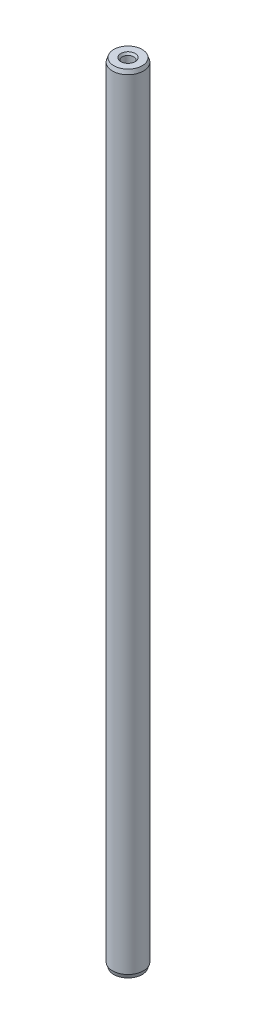
ISO-10303-21;
HEADER;
FILE_DESCRIPTION(('STEP AP214'),'2;1');
FILE_NAME('part.step','',(''),(''),'','','');
FILE_SCHEMA(('AUTOMOTIVE_DESIGN { 1 0 10303 214 1 1 1 1 }'));
ENDSEC;
DATA;
#1=APPLICATION_CONTEXT('core data for automotive mechanical design processes');
#2=APPLICATION_PROTOCOL_DEFINITION('international standard','automotive_design',2000,#1);
#3=PRODUCT_CONTEXT('',#1,'mechanical');
#4=PRODUCT('Part','Part','',(#3));
#5=PRODUCT_RELATED_PRODUCT_CATEGORY('part','',(#4));
#6=PRODUCT_DEFINITION_FORMATION('','',#4);
#7=PRODUCT_DEFINITION_CONTEXT('part definition',#1,'design');
#8=PRODUCT_DEFINITION('design','',#6,#7);
#9=PRODUCT_DEFINITION_SHAPE('','',#8);
#10=(LENGTH_UNIT() NAMED_UNIT(*) SI_UNIT(.MILLI.,.METRE.));
#11=(NAMED_UNIT(*) PLANE_ANGLE_UNIT() SI_UNIT($,.RADIAN.));
#12=(NAMED_UNIT(*) SI_UNIT($,.STERADIAN.) SOLID_ANGLE_UNIT());
#13=UNCERTAINTY_MEASURE_WITH_UNIT(LENGTH_MEASURE(1.E-05),#10,'distance_accuracy_value','');
#14=(GEOMETRIC_REPRESENTATION_CONTEXT(3) GLOBAL_UNCERTAINTY_ASSIGNED_CONTEXT((#13)) GLOBAL_UNIT_ASSIGNED_CONTEXT((#10,
#11,#12)) REPRESENTATION_CONTEXT('',''));
#15=CARTESIAN_POINT('',(0.,0.,0.));
#16=DIRECTION('',(0.,0.,1.));
#17=DIRECTION('',(1.,0.,0.));
#18=AXIS2_PLACEMENT_3D('',#15,#16,#17);
#19=CARTESIAN_POINT('',(-1.06592274227067,-67.9990630691805,-1.12643595849704));
#20=DIRECTION('',(0.,-1.,0.));
#21=DIRECTION('',(0.,0.,-1.));
#22=AXIS2_PLACEMENT_3D('',#19,#20,#21);
#23=CONICAL_SURFACE('',#22,1.13029999982928,1.02974425835872);
#24=CARTESIAN_POINT('',(-1.06592274227067,-67.3199103114257,-1.12643595858231));
#25=VERTEX_POINT('',#24);
#26=VERTEX_LOOP('',#25);
#27=FACE_BOUND('',#26,.T.);
#28=CARTESIAN_POINT('',(-1.06592274227067,-67.9990630692749,-1.12643595849704));
#29=DIRECTION('',(0.,-1.,0.));
#30=DIRECTION('',(0.,0.,-1.));
#31=AXIS2_PLACEMENT_3D('',#28,#29,#30);
#32=CIRCLE('',#31,1.1303);
#33=CARTESIAN_POINT('',(-1.06592274227067,-67.9990630692749,-2.25673595849704));
#34=VERTEX_POINT('',#33);
#35=EDGE_CURVE('E37',#34,#34,#32,.T.);
#36=ORIENTED_EDGE('',*,*,#35,.T.);
#37=EDGE_LOOP('',(#36));
#38=FACE_BOUND('',#37,.T.);
#39=ADVANCED_FACE('F17',(#27,#38),#23,.F.);
#40=CARTESIAN_POINT('',(-1.06592274227067,72.9709369307443,-1.12643595849704));
#41=DIRECTION('',(0.,1.,0.));
#42=DIRECTION('',(0.,0.,1.));
#43=AXIS2_PLACEMENT_3D('',#40,#41,#42);
#44=CONICAL_SURFACE('',#43,1.13029999999981,1.02974425864718);
#45=CARTESIAN_POINT('',(-1.06592274227067,72.2917841729895,-1.12643595838335));
#46=VERTEX_POINT('',#45);
#47=VERTEX_LOOP('',#46);
#48=FACE_BOUND('',#47,.T.);
#49=CARTESIAN_POINT('',(-1.06592274227067,72.9709369307251,-1.12643595849704));
#50=DIRECTION('',(0.,1.,0.));
#51=DIRECTION('',(0.,0.,1.));
#52=AXIS2_PLACEMENT_3D('',#49,#50,#51);
#53=CIRCLE('',#52,1.1303);
#54=CARTESIAN_POINT('',(-1.06592274227067,72.9709369307251,0.00386404150296005));
#55=VERTEX_POINT('',#54);
#56=EDGE_CURVE('E39',#55,#55,#53,.T.);
#57=ORIENTED_EDGE('',*,*,#56,.T.);
#58=EDGE_LOOP('',(#57));
#59=FACE_BOUND('',#58,.T.);
#60=ADVANCED_FACE('F34',(#48,#59),#44,.F.);
#61=CARTESIAN_POINT('',(-1.06592274227067,-73.7140630692749,-1.12643595849704));
#62=DIRECTION('',(0.,-1.,0.));
#63=DIRECTION('',(0.,0.,-1.));
#64=AXIS2_PLACEMENT_3D('',#61,#62,#63);
#65=CYLINDRICAL_SURFACE('',#64,1.1303);
#66=ORIENTED_EDGE('',*,*,#35,.F.);
#67=EDGE_LOOP('',(#66));
#68=FACE_BOUND('',#67,.T.);
#69=CARTESIAN_POINT('',(-1.06592274227067,-73.2741221641504,-1.12643595849704));
#70=DIRECTION('',(0.,-1.,0.));
#71=DIRECTION('',(0.,0.,-1.));
#72=AXIS2_PLACEMENT_3D('',#69,#70,#71);
#73=CIRCLE('',#72,1.13030000005665);
#74=CARTESIAN_POINT('',(-1.06592274227067,-73.2741221641504,-2.25673595855369));
#75=VERTEX_POINT('',#74);
#76=EDGE_CURVE('E42',#75,#75,#73,.T.);
#77=ORIENTED_EDGE('',*,*,#76,.T.);
#78=EDGE_LOOP('',(#77));
#79=FACE_BOUND('',#78,.T.);
#80=ADVANCED_FACE('F149',(#68,#79),#65,.F.);
#81=CARTESIAN_POINT('',(-1.06592274227067,78.6859369307251,-1.12643595849704));
#82=DIRECTION('',(0.,1.,0.));
#83=DIRECTION('',(0.,0.,1.));
#84=AXIS2_PLACEMENT_3D('',#81,#82,#83);
#85=CYLINDRICAL_SURFACE('',#84,1.1303);
#86=ORIENTED_EDGE('',*,*,#56,.F.);
#87=EDGE_LOOP('',(#86));
#88=FACE_BOUND('',#87,.T.);
#89=CARTESIAN_POINT('',(-1.06592274227067,78.2459960256006,-1.12643595849704));
#90=DIRECTION('',(0.,1.,0.));
#91=DIRECTION('',(0.,0.,1.));
#92=AXIS2_PLACEMENT_3D('',#89,#90,#91);
#93=CIRCLE('',#92,1.13029999999981);
#94=CARTESIAN_POINT('',(-1.06592274227067,78.2459960256006,0.00386404150276576));
#95=VERTEX_POINT('',#94);
#96=EDGE_CURVE('E56',#95,#95,#93,.T.);
#97=ORIENTED_EDGE('',*,*,#96,.T.);
#98=EDGE_LOOP('',(#97));
#99=FACE_BOUND('',#98,.T.);
#100=ADVANCED_FACE('F139',(#88,#99),#85,.F.);
#101=CARTESIAN_POINT('',(-1.06592274227067,-73.7140630692465,-1.12643595849704));
#102=DIRECTION('',(0.,-1.,0.));
#103=DIRECTION('',(0.,0.,-1.));
#104=AXIS2_PLACEMENT_3D('',#101,#102,#103);
#105=CONICAL_SURFACE('',#104,1.38430000004064,0.523598775596947);
#106=ORIENTED_EDGE('',*,*,#76,.F.);
#107=EDGE_LOOP('',(#106));
#108=FACE_BOUND('',#107,.T.);
#109=CARTESIAN_POINT('',(-1.06592274227067,-73.7140630692465,-1.12643595849704));
#110=DIRECTION('',(0.,-1.,0.));
#111=DIRECTION('',(0.,0.,-1.));
#112=AXIS2_PLACEMENT_3D('',#109,#110,#111);
#113=CIRCLE('',#112,1.38430000004064);
#114=CARTESIAN_POINT('',(-1.06592274227067,-73.7140630692465,-2.51073595853768));
#115=VERTEX_POINT('',#114);
#116=EDGE_CURVE('E20',#115,#115,#113,.T.);
#117=ORIENTED_EDGE('',*,*,#116,.T.);
#118=EDGE_LOOP('',(#117));
#119=FACE_BOUND('',#118,.T.);
#120=ADVANCED_FACE('F90',(#108,#119),#105,.F.);
#121=CARTESIAN_POINT('',(-1.06592274227067,78.685936930583,-1.12643595849704));
#122=DIRECTION('',(0.,1.,0.));
#123=DIRECTION('',(0.,0.,1.));
#124=AXIS2_PLACEMENT_3D('',#121,#122,#123);
#125=CONICAL_SURFACE('',#124,1.38429999992695,0.523598775637904);
#126=ORIENTED_EDGE('',*,*,#96,.F.);
#127=EDGE_LOOP('',(#126));
#128=FACE_BOUND('',#127,.T.);
#129=CARTESIAN_POINT('',(-1.06592274227067,78.6859369308104,-1.12643595849704));
#130=DIRECTION('',(0.,1.,0.));
#131=DIRECTION('',(0.,0.,1.));
#132=AXIS2_PLACEMENT_3D('',#129,#130,#131);
#133=CIRCLE('',#132,1.38430000005823);
#134=CARTESIAN_POINT('',(-1.06592274227067,78.6859369308104,0.257864041561186));
#135=VERTEX_POINT('',#134);
#136=EDGE_CURVE('E51',#135,#135,#133,.T.);
#137=ORIENTED_EDGE('',*,*,#136,.T.);
#138=EDGE_LOOP('',(#137));
#139=FACE_BOUND('',#138,.T.);
#140=ADVANCED_FACE('F81',(#128,#139),#125,.F.);
#141=CARTESIAN_POINT('',(1.67727725772931,-73.7140630692749,-1.12643595849704));
#142=DIRECTION('',(0.,1.,0.));
#143=DIRECTION('',(0.,0.,1.));
#144=AXIS2_PLACEMENT_3D('',#141,#142,#143);
#145=PLANE('',#144);
#146=CARTESIAN_POINT('',(-1.06592274227067,-73.7140630692465,-1.12643595849704));
#147=DIRECTION('',(0.,1.,0.));
#148=DIRECTION('',(0.,0.,1.));
#149=AXIS2_PLACEMENT_3D('',#146,#147,#148);
#150=CIRCLE('',#149,2.74319999999761);
#151=CARTESIAN_POINT('',(-1.06592274227067,-73.7140630692465,1.61676404150057));
#152=VERTEX_POINT('',#151);
#153=EDGE_CURVE('E49',#152,#152,#150,.T.);
#154=ORIENTED_EDGE('',*,*,#153,.F.);
#155=EDGE_LOOP('',(#154));
#156=FACE_BOUND('',#155,.T.);
#157=ORIENTED_EDGE('',*,*,#116,.F.);
#158=EDGE_LOOP('',(#157));
#159=FACE_BOUND('',#158,.T.);
#160=ADVANCED_FACE('F78',(#156,#159),#145,.F.);
#161=CARTESIAN_POINT('',(-1.06592274227067,78.6859369307251,-1.12643595849704));
#162=DIRECTION('',(0.,-1.,0.));
#163=DIRECTION('',(0.,0.,-1.));
#164=AXIS2_PLACEMENT_3D('',#161,#162,#163);
#165=PLANE('',#164);
#166=CARTESIAN_POINT('',(-1.06592274227067,78.6859369306967,-1.12643595849704));
#167=DIRECTION('',(0.,-1.,0.));
#168=DIRECTION('',(0.,0.,-1.));
#169=AXIS2_PLACEMENT_3D('',#166,#167,#168);
#170=CIRCLE('',#169,2.74320000003551);
#171=CARTESIAN_POINT('',(-1.06592274227067,78.6859369306967,-3.86963595853255));
#172=VERTEX_POINT('',#171);
#173=EDGE_CURVE('E46',#172,#172,#170,.T.);
#174=ORIENTED_EDGE('',*,*,#173,.F.);
#175=EDGE_LOOP('',(#174));
#176=FACE_BOUND('',#175,.T.);
#177=ORIENTED_EDGE('',*,*,#136,.F.);
#178=EDGE_LOOP('',(#177));
#179=FACE_BOUND('',#178,.T.);
#180=ADVANCED_FACE('F74',(#176,#179),#165,.F.);
#181=CARTESIAN_POINT('',(-1.06592274227067,-72.9520630694083,-1.12643595849704));
#182=DIRECTION('',(0.,1.,0.));
#183=DIRECTION('',(0.,0.,1.));
#184=AXIS2_PLACEMENT_3D('',#181,#182,#183);
#185=CONICAL_SURFACE('',#184,2.99719999995318,0.321750554407832);
#186=CARTESIAN_POINT('',(-1.06592274227067,-72.9520630692749,-1.12643595849704));
#187=DIRECTION('',(0.,1.,0.));
#188=DIRECTION('',(0.,0.,1.));
#189=AXIS2_PLACEMENT_3D('',#186,#187,#188);
#190=CIRCLE('',#189,2.9972);
#191=CARTESIAN_POINT('',(-1.06592274227067,-72.9520630692749,1.87076404150296));
#192=VERTEX_POINT('',#191);
#193=EDGE_CURVE('E26',#192,#192,#190,.T.);
#194=ORIENTED_EDGE('',*,*,#193,.F.);
#195=EDGE_LOOP('',(#194));
#196=FACE_BOUND('',#195,.T.);
#197=ORIENTED_EDGE('',*,*,#153,.T.);
#198=EDGE_LOOP('',(#197));
#199=FACE_BOUND('',#198,.T.);
#200=ADVANCED_FACE('F70',(#196,#199),#185,.T.);
#201=CARTESIAN_POINT('',(-1.06592274227067,77.9239369308016,-1.12643595849704));
#202=DIRECTION('',(0.,-1.,0.));
#203=DIRECTION('',(0.,0.,-1.));
#204=AXIS2_PLACEMENT_3D('',#201,#202,#203);
#205=CONICAL_SURFACE('',#204,2.99720000003845,0.321750554441401);
#206=CARTESIAN_POINT('',(-1.06592274227067,77.9239369307251,-1.12643595849704));
#207=DIRECTION('',(0.,1.,0.));
#208=DIRECTION('',(0.,0.,1.));
#209=AXIS2_PLACEMENT_3D('',#206,#207,#208);
#210=CIRCLE('',#209,2.9972);
#211=CARTESIAN_POINT('',(-1.06592274227067,77.9239369307251,1.87076404150296));
#212=VERTEX_POINT('',#211);
#213=EDGE_CURVE('E11',#212,#212,#210,.F.);
#214=ORIENTED_EDGE('',*,*,#213,.F.);
#215=EDGE_LOOP('',(#214));
#216=FACE_BOUND('',#215,.T.);
#217=ORIENTED_EDGE('',*,*,#173,.T.);
#218=EDGE_LOOP('',(#217));
#219=FACE_BOUND('',#218,.T.);
#220=ADVANCED_FACE('F73',(#216,#219),#205,.T.);
#221=CARTESIAN_POINT('',(-1.06592274227067,78.6859369307251,-1.12643595849704));
#222=DIRECTION('',(0.,1.,0.));
#223=DIRECTION('',(0.,0.,1.));
#224=AXIS2_PLACEMENT_3D('',#221,#222,#223);
#225=CYLINDRICAL_SURFACE('',#224,2.9972);
#226=ORIENTED_EDGE('',*,*,#213,.T.);
#227=EDGE_LOOP('',(#226));
#228=FACE_BOUND('',#227,.T.);
#229=ORIENTED_EDGE('',*,*,#193,.T.);
#230=EDGE_LOOP('',(#229));
#231=FACE_BOUND('',#230,.T.);
#232=ADVANCED_FACE('F68',(#228,#231),#225,.T.);
#233=CLOSED_SHELL('',(#39,#60,#80,#100,#120,#140,#160,#180,#200,#220,#232));
#234=MANIFOLD_SOLID_BREP('B1',#233);
#235=ADVANCED_BREP_SHAPE_REPRESENTATION('',(#18,#234),#14);
#236=SHAPE_DEFINITION_REPRESENTATION(#9,#235);
ENDSEC;
END-ISO-10303-21;
